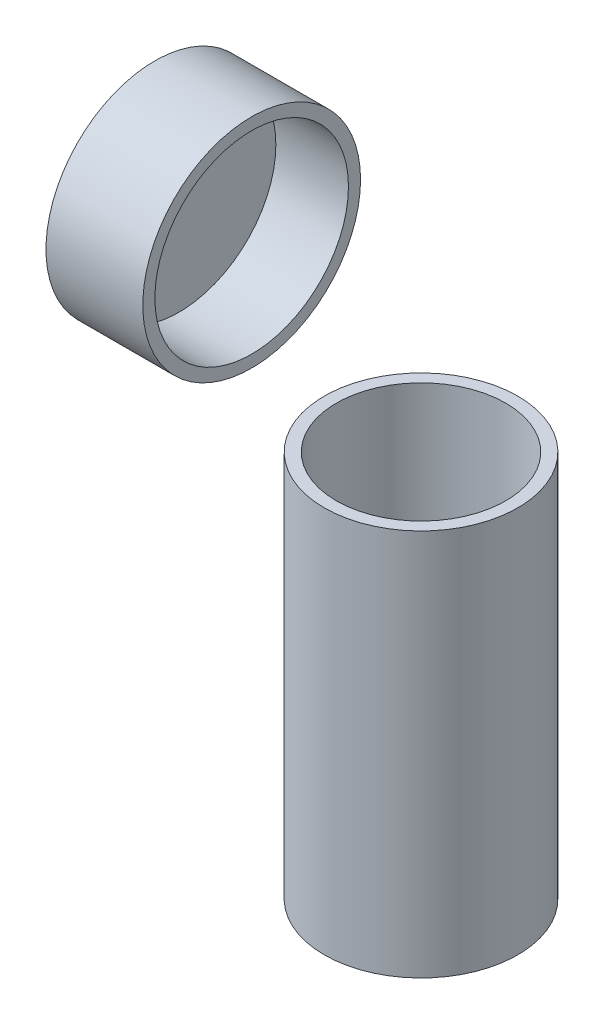
ISO-10303-21;
HEADER;
FILE_DESCRIPTION(('STEP AP214'),'2;1');
FILE_NAME('part.step','',(''),(''),'','','');
FILE_SCHEMA(('AUTOMOTIVE_DESIGN { 1 0 10303 214 1 1 1 1 }'));
ENDSEC;
DATA;
#1=APPLICATION_CONTEXT('core data for automotive mechanical design processes');
#2=APPLICATION_PROTOCOL_DEFINITION('international standard','automotive_design',2000,#1);
#3=PRODUCT_CONTEXT('',#1,'mechanical');
#4=PRODUCT('Part','Part','',(#3));
#5=PRODUCT_RELATED_PRODUCT_CATEGORY('part','',(#4));
#6=PRODUCT_DEFINITION_FORMATION('','',#4);
#7=PRODUCT_DEFINITION_CONTEXT('part definition',#1,'design');
#8=PRODUCT_DEFINITION('design','',#6,#7);
#9=PRODUCT_DEFINITION_SHAPE('','',#8);
#10=(LENGTH_UNIT() NAMED_UNIT(*) SI_UNIT(.MILLI.,.METRE.));
#11=(NAMED_UNIT(*) PLANE_ANGLE_UNIT() SI_UNIT($,.RADIAN.));
#12=(NAMED_UNIT(*) SI_UNIT($,.STERADIAN.) SOLID_ANGLE_UNIT());
#13=UNCERTAINTY_MEASURE_WITH_UNIT(LENGTH_MEASURE(1.E-05),#10,'distance_accuracy_value','');
#14=(GEOMETRIC_REPRESENTATION_CONTEXT(3) GLOBAL_UNCERTAINTY_ASSIGNED_CONTEXT((#13)) GLOBAL_UNIT_ASSIGNED_CONTEXT((#10,
#11,#12)) REPRESENTATION_CONTEXT('',''));
#15=CARTESIAN_POINT('',(0.,0.,0.));
#16=DIRECTION('',(0.,0.,1.));
#17=DIRECTION('',(1.,0.,0.));
#18=AXIS2_PLACEMENT_3D('',#15,#16,#17);
#19=CARTESIAN_POINT('',(-34.925,63.5,0.));
#20=DIRECTION('',(1.,0.,0.));
#21=DIRECTION('',(0.,0.,-1.));
#22=AXIS2_PLACEMENT_3D('',#19,#20,#21);
#23=CYLINDRICAL_SURFACE('',#22,14.2875);
#24=CARTESIAN_POINT('',(-34.925,63.5,0.));
#25=DIRECTION('',(1.,0.,0.));
#26=DIRECTION('',(0.,0.,-1.));
#27=AXIS2_PLACEMENT_3D('',#24,#25,#26);
#28=CIRCLE('',#27,14.2875);
#29=CARTESIAN_POINT('',(-34.925,63.5,-14.2875));
#30=VERTEX_POINT('',#29);
#31=EDGE_CURVE('E11',#30,#30,#28,.T.);
#32=ORIENTED_EDGE('',*,*,#31,.T.);
#33=EDGE_LOOP('',(#32));
#34=FACE_BOUND('',#33,.T.);
#35=CARTESIAN_POINT('',(-22.225,63.5,0.));
#36=DIRECTION('',(1.,0.,0.));
#37=DIRECTION('',(0.,0.,-1.));
#38=AXIS2_PLACEMENT_3D('',#35,#36,#37);
#39=CIRCLE('',#38,14.2875);
#40=CARTESIAN_POINT('',(-22.225,63.5,-14.2875));
#41=VERTEX_POINT('',#40);
#42=EDGE_CURVE('E51',#41,#41,#39,.T.);
#43=ORIENTED_EDGE('',*,*,#42,.F.);
#44=EDGE_LOOP('',(#43));
#45=FACE_BOUND('',#44,.T.);
#46=ADVANCED_FACE('F48',(#34,#45),#23,.T.);
#47=CARTESIAN_POINT('',(-34.925,63.5,0.));
#48=DIRECTION('',(1.,0.,0.));
#49=DIRECTION('',(0.,0.,-1.));
#50=AXIS2_PLACEMENT_3D('',#47,#48,#49);
#51=PLANE('',#50);
#52=ORIENTED_EDGE('',*,*,#31,.F.);
#53=EDGE_LOOP('',(#52));
#54=FACE_BOUND('',#53,.T.);
#55=ADVANCED_FACE('F77',(#54),#51,.F.);
#56=CARTESIAN_POINT('',(-22.225,63.5,0.));
#57=DIRECTION('',(1.,0.,0.));
#58=DIRECTION('',(0.,0.,-1.));
#59=AXIS2_PLACEMENT_3D('',#56,#57,#58);
#60=PLANE('',#59);
#61=CARTESIAN_POINT('',(-22.225,63.5,0.));
#62=DIRECTION('',(1.,0.,0.));
#63=DIRECTION('',(0.,0.,-1.));
#64=AXIS2_PLACEMENT_3D('',#61,#62,#63);
#65=CIRCLE('',#64,12.7);
#66=CARTESIAN_POINT('',(-22.225,63.5,-12.7));
#67=VERTEX_POINT('',#66);
#68=EDGE_CURVE('E60',#67,#67,#65,.T.);
#69=ORIENTED_EDGE('',*,*,#68,.F.);
#70=EDGE_LOOP('',(#69));
#71=FACE_BOUND('',#70,.T.);
#72=ORIENTED_EDGE('',*,*,#42,.T.);
#73=EDGE_LOOP('',(#72));
#74=FACE_BOUND('',#73,.T.);
#75=ADVANCED_FACE('F71',(#71,#74),#60,.T.);
#76=CARTESIAN_POINT('',(-31.75,63.5,0.));
#77=DIRECTION('',(1.,0.,0.));
#78=DIRECTION('',(0.,0.,-1.));
#79=AXIS2_PLACEMENT_3D('',#76,#77,#78);
#80=CYLINDRICAL_SURFACE('',#79,12.7);
#81=CARTESIAN_POINT('',(-31.75,63.5,0.));
#82=DIRECTION('',(1.,0.,0.));
#83=DIRECTION('',(0.,0.,-1.));
#84=AXIS2_PLACEMENT_3D('',#81,#82,#83);
#85=CIRCLE('',#84,12.7);
#86=CARTESIAN_POINT('',(-31.75,63.5,-12.7));
#87=VERTEX_POINT('',#86);
#88=EDGE_CURVE('E58',#87,#87,#85,.T.);
#89=CARTESIAN_POINT('',(-31.75,63.5,-12.7));
#90=CARTESIAN_POINT('',(-31.65078125,63.5,-12.7));
#91=CARTESIAN_POINT('',(-31.5515625,63.5,-12.7));
#92=CARTESIAN_POINT('',(-31.353125,63.5,-12.7));
#93=CARTESIAN_POINT('',(-31.25390625,63.5,-12.7));
#94=CARTESIAN_POINT('',(-31.05546875,63.5,-12.7));
#95=CARTESIAN_POINT('',(-30.95625,63.5,-12.7));
#96=CARTESIAN_POINT('',(-30.7578125,63.5,-12.7));
#97=CARTESIAN_POINT('',(-30.65859375,63.5,-12.7));
#98=CARTESIAN_POINT('',(-30.46015625,63.5,-12.7));
#99=CARTESIAN_POINT('',(-30.3609375,63.5,-12.7));
#100=CARTESIAN_POINT('',(-30.1625,63.5,-12.7));
#101=CARTESIAN_POINT('',(-30.06328125,63.5,-12.7));
#102=CARTESIAN_POINT('',(-29.86484375,63.5,-12.7));
#103=CARTESIAN_POINT('',(-29.765625,63.5,-12.7));
#104=CARTESIAN_POINT('',(-29.5671875,63.5,-12.7));
#105=CARTESIAN_POINT('',(-29.46796875,63.5,-12.7));
#106=CARTESIAN_POINT('',(-29.26953125,63.5,-12.7));
#107=CARTESIAN_POINT('',(-29.1703125,63.5,-12.7));
#108=CARTESIAN_POINT('',(-28.971875,63.5,-12.7));
#109=CARTESIAN_POINT('',(-28.87265625,63.5,-12.7));
#110=CARTESIAN_POINT('',(-28.67421875,63.5,-12.7));
#111=CARTESIAN_POINT('',(-28.575,63.5,-12.7));
#112=CARTESIAN_POINT('',(-28.3765625,63.5,-12.7));
#113=CARTESIAN_POINT('',(-28.27734375,63.5,-12.7));
#114=CARTESIAN_POINT('',(-28.07890625,63.5,-12.7));
#115=CARTESIAN_POINT('',(-27.9796875,63.5,-12.7));
#116=CARTESIAN_POINT('',(-27.78125,63.5,-12.7));
#117=CARTESIAN_POINT('',(-27.68203125,63.5,-12.7));
#118=CARTESIAN_POINT('',(-27.48359375,63.5,-12.7));
#119=CARTESIAN_POINT('',(-27.384375,63.5,-12.7));
#120=CARTESIAN_POINT('',(-27.1859375,63.5,-12.7));
#121=CARTESIAN_POINT('',(-27.08671875,63.5,-12.7));
#122=CARTESIAN_POINT('',(-26.88828125,63.5,-12.7));
#123=CARTESIAN_POINT('',(-26.7890625,63.5,-12.7));
#124=CARTESIAN_POINT('',(-26.590625,63.5,-12.7));
#125=CARTESIAN_POINT('',(-26.49140625,63.5,-12.7));
#126=CARTESIAN_POINT('',(-26.29296875,63.5,-12.7));
#127=CARTESIAN_POINT('',(-26.19375,63.5,-12.7));
#128=CARTESIAN_POINT('',(-25.9953125,63.5,-12.7));
#129=CARTESIAN_POINT('',(-25.89609375,63.5,-12.7));
#130=CARTESIAN_POINT('',(-25.69765625,63.5,-12.7));
#131=CARTESIAN_POINT('',(-25.5984375,63.5,-12.7));
#132=CARTESIAN_POINT('',(-25.4,63.5,-12.7));
#133=CARTESIAN_POINT('',(-25.30078125,63.5,-12.7));
#134=CARTESIAN_POINT('',(-25.10234375,63.5,-12.7));
#135=CARTESIAN_POINT('',(-25.003125,63.5,-12.7));
#136=CARTESIAN_POINT('',(-24.8046875,63.5,-12.7));
#137=CARTESIAN_POINT('',(-24.70546875,63.5,-12.7));
#138=CARTESIAN_POINT('',(-24.50703125,63.5,-12.7));
#139=CARTESIAN_POINT('',(-24.4078125,63.5,-12.7));
#140=CARTESIAN_POINT('',(-24.209375,63.5,-12.7));
#141=CARTESIAN_POINT('',(-24.11015625,63.5,-12.7));
#142=CARTESIAN_POINT('',(-23.91171875,63.5,-12.7));
#143=CARTESIAN_POINT('',(-23.8125,63.5,-12.7));
#144=CARTESIAN_POINT('',(-23.6140625,63.5,-12.7));
#145=CARTESIAN_POINT('',(-23.51484375,63.5,-12.7));
#146=CARTESIAN_POINT('',(-23.31640625,63.5,-12.7));
#147=CARTESIAN_POINT('',(-23.2171875,63.5,-12.7));
#148=CARTESIAN_POINT('',(-23.01875,63.5,-12.7));
#149=CARTESIAN_POINT('',(-22.91953125,63.5,-12.7));
#150=CARTESIAN_POINT('',(-22.72109375,63.5,-12.7));
#151=CARTESIAN_POINT('',(-22.621875,63.5,-12.7));
#152=CARTESIAN_POINT('',(-22.4234375,63.5,-12.7));
#153=CARTESIAN_POINT('',(-22.32421875,63.5,-12.7));
#154=CARTESIAN_POINT('',(-22.225,63.5,-12.7));
#155=B_SPLINE_CURVE_WITH_KNOTS('',3,(#89,#90,#91,#92,#93,#94,#95,#96,#97,#98,#99,#100,#101,#102,
#103,#104,#105,#106,#107,#108,#109,#110,#111,#112,#113,#114,#115,#116,#117,#118,#119,#120,#121,
#122,#123,#124,#125,#126,#127,#128,#129,#130,#131,#132,#133,#134,#135,#136,#137,#138,#139,#140,
#141,#142,#143,#144,#145,#146,#147,#148,#149,#150,#151,#152,#153,#154),.UNSPECIFIED.,.F.,.F.,(4,
2,2,2,2,2,2,2,2,2,2,2,2,2,2,2,2,2,2,2,2,2,2,2,2,2,2,2,2,2,2,2,4),(0.,0.29765625,
0.595312500000004,0.892968750000004,1.190625,1.48828125,1.7859375,2.08359375,2.38125,
2.67890625000001,2.97656250000001,3.27421875000001,3.57187500000001,3.86953125000001,
4.16718750000001,4.46484375000001,4.76250000000001,5.06015625000001,5.35781250000001,
5.65546875000001,5.95312500000001,6.25078125000001,6.54843750000001,6.84609375000001,
7.14375000000001,7.44140625000001,7.73906250000001,8.03671875000001,8.334375,8.63203125,
8.92968750000001,9.22734375000001,9.52500000000001),.UNSPECIFIED.);
#156=EDGE_CURVE('BSEAM68',#87,#67,#155,.T.);
#157=ORIENTED_EDGE('',*,*,#88,.F.);
#158=ORIENTED_EDGE('',*,*,#68,.T.);
#159=ORIENTED_EDGE('',*,*,#156,.T.);
#160=ORIENTED_EDGE('',*,*,#156,.F.);
#161=EDGE_LOOP('',(#157,#159,#158,#160));
#162=FACE_BOUND('',#161,.T.);
#163=ADVANCED_FACE('F68',(#162),#80,.F.);
#164=CARTESIAN_POINT('',(-31.75,63.5,0.));
#165=DIRECTION('',(1.,0.,0.));
#166=DIRECTION('',(0.,0.,-1.));
#167=AXIS2_PLACEMENT_3D('',#164,#165,#166);
#168=PLANE('',#167);
#169=ORIENTED_EDGE('',*,*,#88,.T.);
#170=EDGE_LOOP('',(#169));
#171=FACE_BOUND('',#170,.T.);
#172=ADVANCED_FACE('F66',(#171),#168,.T.);
#173=CLOSED_SHELL('',(#46,#55,#75,#163,#172));
#174=MANIFOLD_SOLID_BREP('B2',#173);
#175=CARTESIAN_POINT('',(0.,50.8,0.));
#176=DIRECTION('',(0.,-1.,0.));
#177=DIRECTION('',(0.,0.,-1.));
#178=AXIS2_PLACEMENT_3D('',#175,#176,#177);
#179=CYLINDRICAL_SURFACE('',#178,12.7);
#180=CARTESIAN_POINT('',(0.,50.8,0.));
#181=DIRECTION('',(0.,1.,0.));
#182=DIRECTION('',(0.,0.,1.));
#183=AXIS2_PLACEMENT_3D('',#180,#181,#182);
#184=CIRCLE('',#183,12.7);
#185=CARTESIAN_POINT('',(0.,50.8,12.7));
#186=VERTEX_POINT('',#185);
#187=EDGE_CURVE('E47',#186,#186,#184,.T.);
#188=ORIENTED_EDGE('',*,*,#187,.F.);
#189=EDGE_LOOP('',(#188));
#190=FACE_BOUND('',#189,.T.);
#191=CARTESIAN_POINT('',(0.,0.,0.));
#192=DIRECTION('',(0.,1.,0.));
#193=DIRECTION('',(0.,0.,1.));
#194=AXIS2_PLACEMENT_3D('',#191,#192,#193);
#195=CIRCLE('',#194,12.7);
#196=CARTESIAN_POINT('',(0.,0.,12.7));
#197=VERTEX_POINT('',#196);
#198=EDGE_CURVE('E131',#197,#197,#195,.T.);
#199=ORIENTED_EDGE('',*,*,#198,.T.);
#200=EDGE_LOOP('',(#199));
#201=FACE_BOUND('',#200,.T.);
#202=ADVANCED_FACE('F128',(#190,#201),#179,.T.);
#203=CARTESIAN_POINT('',(0.,50.8,0.));
#204=DIRECTION('',(0.,1.,0.));
#205=DIRECTION('',(0.,0.,1.));
#206=AXIS2_PLACEMENT_3D('',#203,#204,#205);
#207=PLANE('',#206);
#208=CARTESIAN_POINT('',(0.,50.8,0.));
#209=DIRECTION('',(0.,1.,0.));
#210=DIRECTION('',(0.,0.,1.));
#211=AXIS2_PLACEMENT_3D('',#208,#209,#210);
#212=CIRCLE('',#211,11.1125);
#213=CARTESIAN_POINT('',(0.,50.8,11.1125));
#214=VERTEX_POINT('',#213);
#215=EDGE_CURVE('E142',#214,#214,#212,.T.);
#216=ORIENTED_EDGE('',*,*,#215,.F.);
#217=EDGE_LOOP('',(#216));
#218=FACE_BOUND('',#217,.T.);
#219=ORIENTED_EDGE('',*,*,#187,.T.);
#220=EDGE_LOOP('',(#219));
#221=FACE_BOUND('',#220,.T.);
#222=ADVANCED_FACE('F159',(#218,#221),#207,.T.);
#223=CARTESIAN_POINT('',(0.,0.,0.));
#224=DIRECTION('',(0.,1.,0.));
#225=DIRECTION('',(0.,0.,1.));
#226=AXIS2_PLACEMENT_3D('',#223,#224,#225);
#227=PLANE('',#226);
#228=ORIENTED_EDGE('',*,*,#198,.F.);
#229=EDGE_LOOP('',(#228));
#230=FACE_BOUND('',#229,.T.);
#231=ADVANCED_FACE('F155',(#230),#227,.F.);
#232=CARTESIAN_POINT('',(0.,6.35,0.));
#233=DIRECTION('',(0.,1.,0.));
#234=DIRECTION('',(0.,0.,1.));
#235=AXIS2_PLACEMENT_3D('',#232,#233,#234);
#236=CYLINDRICAL_SURFACE('',#235,11.1125);
#237=CARTESIAN_POINT('',(0.,6.35,0.));
#238=DIRECTION('',(0.,1.,0.));
#239=DIRECTION('',(0.,0.,1.));
#240=AXIS2_PLACEMENT_3D('',#237,#238,#239);
#241=CIRCLE('',#240,11.1125);
#242=CARTESIAN_POINT('',(0.,6.35,11.1125));
#243=VERTEX_POINT('',#242);
#244=EDGE_CURVE('E140',#243,#243,#241,.T.);
#245=ORIENTED_EDGE('',*,*,#244,.F.);
#246=EDGE_LOOP('',(#245));
#247=FACE_BOUND('',#246,.T.);
#248=ORIENTED_EDGE('',*,*,#215,.T.);
#249=EDGE_LOOP('',(#248));
#250=FACE_BOUND('',#249,.T.);
#251=ADVANCED_FACE('F152',(#247,#250),#236,.F.);
#252=CARTESIAN_POINT('',(0.,6.35,0.));
#253=DIRECTION('',(0.,1.,0.));
#254=DIRECTION('',(0.,0.,1.));
#255=AXIS2_PLACEMENT_3D('',#252,#253,#254);
#256=PLANE('',#255);
#257=ORIENTED_EDGE('',*,*,#244,.T.);
#258=EDGE_LOOP('',(#257));
#259=FACE_BOUND('',#258,.T.);
#260=ADVANCED_FACE('F150',(#259),#256,.T.);
#261=CLOSED_SHELL('',(#202,#222,#231,#251,#260));
#262=MANIFOLD_SOLID_BREP('B6',#261);
#263=ADVANCED_BREP_SHAPE_REPRESENTATION('',(#18,#174,#262),#14);
#264=SHAPE_DEFINITION_REPRESENTATION(#9,#263);
ENDSEC;
END-ISO-10303-21;
